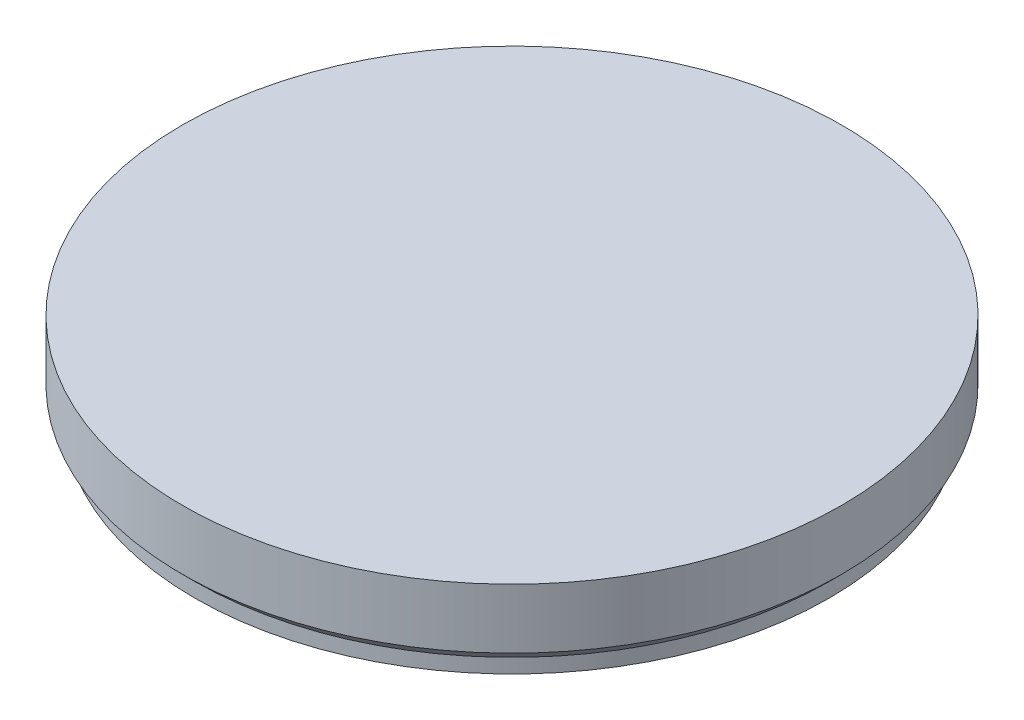
ISO-10303-21;
HEADER;
FILE_DESCRIPTION(('STEP AP214'),'2;1');
FILE_NAME('part.step','',(''),(''),'','','');
FILE_SCHEMA(('AUTOMOTIVE_DESIGN { 1 0 10303 214 1 1 1 1 }'));
ENDSEC;
DATA;
#1=APPLICATION_CONTEXT('core data for automotive mechanical design processes');
#2=APPLICATION_PROTOCOL_DEFINITION('international standard','automotive_design',2000,#1);
#3=PRODUCT_CONTEXT('',#1,'mechanical');
#4=PRODUCT('Part','Part','',(#3));
#5=PRODUCT_RELATED_PRODUCT_CATEGORY('part','',(#4));
#6=PRODUCT_DEFINITION_FORMATION('','',#4);
#7=PRODUCT_DEFINITION_CONTEXT('part definition',#1,'design');
#8=PRODUCT_DEFINITION('design','',#6,#7);
#9=PRODUCT_DEFINITION_SHAPE('','',#8);
#10=(LENGTH_UNIT() NAMED_UNIT(*) SI_UNIT(.MILLI.,.METRE.));
#11=(NAMED_UNIT(*) PLANE_ANGLE_UNIT() SI_UNIT($,.RADIAN.));
#12=(NAMED_UNIT(*) SI_UNIT($,.STERADIAN.) SOLID_ANGLE_UNIT());
#13=UNCERTAINTY_MEASURE_WITH_UNIT(LENGTH_MEASURE(1.E-05),#10,'distance_accuracy_value','');
#14=(GEOMETRIC_REPRESENTATION_CONTEXT(3) GLOBAL_UNCERTAINTY_ASSIGNED_CONTEXT((#13)) GLOBAL_UNIT_ASSIGNED_CONTEXT((#10,
#11,#12)) REPRESENTATION_CONTEXT('',''));
#15=CARTESIAN_POINT('',(0.,0.,0.));
#16=DIRECTION('',(0.,0.,1.));
#17=DIRECTION('',(1.,0.,0.));
#18=AXIS2_PLACEMENT_3D('',#15,#16,#17);
#19=CARTESIAN_POINT('',(0.,3.49999999999999,0.));
#20=DIRECTION('',(0.,1.,0.));
#21=DIRECTION('',(-1.,0.,0.));
#22=AXIS2_PLACEMENT_3D('',#19,#20,#21);
#23=CONICAL_SURFACE('',#22,77.,0.785398163397449);
#24=CARTESIAN_POINT('',(0.,3.49999999999999,0.));
#25=DIRECTION('',(0.,1.,0.));
#26=DIRECTION('',(-1.,0.,0.));
#27=AXIS2_PLACEMENT_3D('',#24,#25,#26);
#28=CIRCLE('',#27,77.);
#29=CARTESIAN_POINT('',(-77.,3.49999999999998,0.));
#30=VERTEX_POINT('',#29);
#31=EDGE_CURVE('E159',#30,#30,#28,.T.);
#32=ORIENTED_EDGE('',*,*,#31,.T.);
#33=EDGE_LOOP('',(#32));
#34=FACE_BOUND('',#33,.T.);
#35=CARTESIAN_POINT('',(0.,6.49999999999998,0.));
#36=DIRECTION('',(0.,1.,0.));
#37=DIRECTION('',(-1.,0.,0.));
#38=AXIS2_PLACEMENT_3D('',#35,#36,#37);
#39=CIRCLE('',#38,80.);
#40=CARTESIAN_POINT('',(-80.,6.49999999999997,0.));
#41=VERTEX_POINT('',#40);
#42=EDGE_CURVE('E116',#41,#41,#39,.F.);
#43=ORIENTED_EDGE('',*,*,#42,.T.);
#44=EDGE_LOOP('',(#43));
#45=FACE_BOUND('',#44,.T.);
#46=ADVANCED_FACE('F46',(#34,#45),#23,.T.);
#47=CARTESIAN_POINT('',(71.,12.,0.));
#48=DIRECTION('',(0.,1.,0.));
#49=DIRECTION('',(-1.,0.,0.));
#50=AXIS2_PLACEMENT_3D('',#47,#48,#49);
#51=PLANE('',#50);
#52=CARTESIAN_POINT('',(0.,12.,0.));
#53=DIRECTION('',(0.,-1.,0.));
#54=DIRECTION('',(1.,0.,0.));
#55=AXIS2_PLACEMENT_3D('',#52,#53,#54);
#56=CIRCLE('',#55,57.5);
#57=CARTESIAN_POINT('',(57.5,12.,0.));
#58=VERTEX_POINT('',#57);
#59=EDGE_CURVE('E148',#58,#58,#56,.T.);
#60=ORIENTED_EDGE('',*,*,#59,.F.);
#61=EDGE_LOOP('',(#60));
#62=FACE_BOUND('',#61,.T.);
#63=DIRECTION('',(0.,0.,1.));
#64=VECTOR('',#63,1.);
#65=CARTESIAN_POINT('',(60.875,12.,0.));
#66=LINE('',#65,#64);
#67=CARTESIAN_POINT('',(60.875,12.,-35.1461976369185));
#68=VERTEX_POINT('',#67);
#69=CARTESIAN_POINT('',(60.875,12.,35.1461976369185));
#70=VERTEX_POINT('',#69);
#71=EDGE_CURVE('E110',#68,#70,#66,.T.);
#72=ORIENTED_EDGE('',*,*,#71,.T.);
#73=DIRECTION('',(-0.866025403784439,0.,0.5));
#74=VECTOR('',#73,1.);
#75=CARTESIAN_POINT('',(30.4375,12.,52.7192964553777));
#76=LINE('',#75,#74);
#77=CARTESIAN_POINT('',(0.,12.,70.292395273837));
#78=VERTEX_POINT('',#77);
#79=EDGE_CURVE('E115',#70,#78,#76,.T.);
#80=ORIENTED_EDGE('',*,*,#79,.T.);
#81=DIRECTION('',(-0.866025403784439,0.,-0.5));
#82=VECTOR('',#81,1.);
#83=CARTESIAN_POINT('',(-30.4375,12.,52.7192964553777));
#84=LINE('',#83,#82);
#85=CARTESIAN_POINT('',(-60.875,12.,35.1461976369185));
#86=VERTEX_POINT('',#85);
#87=EDGE_CURVE('E130',#78,#86,#84,.T.);
#88=ORIENTED_EDGE('',*,*,#87,.T.);
#89=DIRECTION('',(0.,0.,-1.));
#90=VECTOR('',#89,1.);
#91=CARTESIAN_POINT('',(-60.875,12.,0.));
#92=LINE('',#91,#90);
#93=CARTESIAN_POINT('',(-60.875,12.,-35.1461976369185));
#94=VERTEX_POINT('',#93);
#95=EDGE_CURVE('E125',#86,#94,#92,.T.);
#96=ORIENTED_EDGE('',*,*,#95,.T.);
#97=DIRECTION('',(0.866025403784439,0.,-0.5));
#98=VECTOR('',#97,1.);
#99=CARTESIAN_POINT('',(-30.4375,12.,-52.7192964553777));
#100=LINE('',#99,#98);
#101=CARTESIAN_POINT('',(0.,12.,-70.2923952738369));
#102=VERTEX_POINT('',#101);
#103=EDGE_CURVE('E121',#94,#102,#100,.T.);
#104=ORIENTED_EDGE('',*,*,#103,.T.);
#105=DIRECTION('',(0.866025403784439,0.,0.5));
#106=VECTOR('',#105,1.);
#107=CARTESIAN_POINT('',(30.4375,12.,-52.7192964553777));
#108=LINE('',#107,#106);
#109=EDGE_CURVE('E103',#102,#68,#108,.T.);
#110=ORIENTED_EDGE('',*,*,#109,.T.);
#111=EDGE_LOOP('',(#72,#80,#88,#96,#104,#110));
#112=FACE_BOUND('',#111,.T.);
#113=ADVANCED_FACE('F118',(#62,#112),#51,.F.);
#114=CARTESIAN_POINT('',(30.4375,0.999999999999997,52.7192964553777));
#115=DIRECTION('',(-0.5,0.,-0.866025403784439));
#116=DIRECTION('',(-0.866025403784439,0.,0.5));
#117=AXIS2_PLACEMENT_3D('',#114,#115,#116);
#118=PLANE('',#117);
#119=ORIENTED_EDGE('',*,*,#79,.F.);
#120=DIRECTION('',(0.,1.,0.));
#121=VECTOR('',#120,1.);
#122=CARTESIAN_POINT('',(60.875,1.,35.1461976369185));
#123=LINE('',#122,#121);
#124=CARTESIAN_POINT('',(60.875,1.,35.1461976369185));
#125=VERTEX_POINT('',#124);
#126=EDGE_CURVE('E112',#125,#70,#123,.T.);
#127=ORIENTED_EDGE('',*,*,#126,.F.);
#128=DIRECTION('',(-0.866025403784439,0.,0.5));
#129=VECTOR('',#128,1.);
#130=CARTESIAN_POINT('',(30.4375,0.999999999999997,52.7192964553777));
#131=LINE('',#130,#129);
#132=CARTESIAN_POINT('',(0.,0.999999999999992,70.292395273837));
#133=VERTEX_POINT('',#132);
#134=EDGE_CURVE('E122',#125,#133,#131,.T.);
#135=ORIENTED_EDGE('',*,*,#134,.T.);
#136=DIRECTION('',(0.,1.,0.));
#137=VECTOR('',#136,1.);
#138=CARTESIAN_POINT('',(0.,0.999999999999992,70.292395273837));
#139=LINE('',#138,#137);
#140=EDGE_CURVE('E62',#133,#78,#139,.T.);
#141=ORIENTED_EDGE('',*,*,#140,.T.);
#142=EDGE_LOOP('',(#119,#127,#135,#141));
#143=FACE_BOUND('',#142,.T.);
#144=ADVANCED_FACE('F201',(#143),#118,.T.);
#145=CARTESIAN_POINT('',(60.875,1.,0.));
#146=DIRECTION('',(-1.,0.,0.));
#147=DIRECTION('',(0.,-1.,0.));
#148=AXIS2_PLACEMENT_3D('',#145,#146,#147);
#149=PLANE('',#148);
#150=ORIENTED_EDGE('',*,*,#71,.F.);
#151=DIRECTION('',(0.,1.,0.));
#152=VECTOR('',#151,1.);
#153=CARTESIAN_POINT('',(60.875,1.,-35.1461976369185));
#154=LINE('',#153,#152);
#155=CARTESIAN_POINT('',(60.875,1.,-35.1461976369185));
#156=VERTEX_POINT('',#155);
#157=EDGE_CURVE('E88',#156,#68,#154,.T.);
#158=ORIENTED_EDGE('',*,*,#157,.F.);
#159=DIRECTION('',(0.,0.,1.));
#160=VECTOR('',#159,1.);
#161=CARTESIAN_POINT('',(60.875,1.,0.));
#162=LINE('',#161,#160);
#163=EDGE_CURVE('E146',#156,#125,#162,.T.);
#164=ORIENTED_EDGE('',*,*,#163,.T.);
#165=ORIENTED_EDGE('',*,*,#126,.T.);
#166=EDGE_LOOP('',(#150,#158,#164,#165));
#167=FACE_BOUND('',#166,.T.);
#168=ADVANCED_FACE('F111',(#167),#149,.T.);
#169=CARTESIAN_POINT('',(30.4375,0.999999999999997,-52.7192964553777));
#170=DIRECTION('',(-0.5,0.,0.866025403784439));
#171=DIRECTION('',(0.866025403784439,0.,0.5));
#172=AXIS2_PLACEMENT_3D('',#169,#170,#171);
#173=PLANE('',#172);
#174=ORIENTED_EDGE('',*,*,#109,.F.);
#175=DIRECTION('',(0.,1.,0.));
#176=VECTOR('',#175,1.);
#177=CARTESIAN_POINT('',(0.,0.999999999999992,-70.2923952738369));
#178=LINE('',#177,#176);
#179=CARTESIAN_POINT('',(0.,0.999999999999992,-70.2923952738369));
#180=VERTEX_POINT('',#179);
#181=EDGE_CURVE('E142',#180,#102,#178,.T.);
#182=ORIENTED_EDGE('',*,*,#181,.F.);
#183=DIRECTION('',(0.866025403784439,0.,0.5));
#184=VECTOR('',#183,1.);
#185=CARTESIAN_POINT('',(30.4375,0.999999999999997,-52.7192964553777));
#186=LINE('',#185,#184);
#187=EDGE_CURVE('E106',#180,#156,#186,.T.);
#188=ORIENTED_EDGE('',*,*,#187,.T.);
#189=ORIENTED_EDGE('',*,*,#157,.T.);
#190=EDGE_LOOP('',(#174,#182,#188,#189));
#191=FACE_BOUND('',#190,.T.);
#192=ADVANCED_FACE('F101',(#191),#173,.T.);
#193=CARTESIAN_POINT('',(-30.4375,0.999999999999987,-52.7192964553777));
#194=DIRECTION('',(0.5,0.,0.866025403784439));
#195=DIRECTION('',(0.866025403784439,0.,-0.5));
#196=AXIS2_PLACEMENT_3D('',#193,#194,#195);
#197=PLANE('',#196);
#198=ORIENTED_EDGE('',*,*,#103,.F.);
#199=DIRECTION('',(0.,1.,0.));
#200=VECTOR('',#199,1.);
#201=CARTESIAN_POINT('',(-60.875,0.999999999999984,-35.1461976369185));
#202=LINE('',#201,#200);
#203=CARTESIAN_POINT('',(-60.875,0.999999999999984,-35.1461976369185));
#204=VERTEX_POINT('',#203);
#205=EDGE_CURVE('E138',#204,#94,#202,.T.);
#206=ORIENTED_EDGE('',*,*,#205,.F.);
#207=DIRECTION('',(0.866025403784439,0.,-0.5));
#208=VECTOR('',#207,1.);
#209=CARTESIAN_POINT('',(-30.4375,0.999999999999987,-52.7192964553777));
#210=LINE('',#209,#208);
#211=EDGE_CURVE('E107',#204,#180,#210,.T.);
#212=ORIENTED_EDGE('',*,*,#211,.T.);
#213=ORIENTED_EDGE('',*,*,#181,.T.);
#214=EDGE_LOOP('',(#198,#206,#212,#213));
#215=FACE_BOUND('',#214,.T.);
#216=ADVANCED_FACE('F188',(#215),#197,.T.);
#217=CARTESIAN_POINT('',(-60.875,0.999999999999984,0.));
#218=DIRECTION('',(1.,0.,0.));
#219=DIRECTION('',(0.,1.,0.));
#220=AXIS2_PLACEMENT_3D('',#217,#218,#219);
#221=PLANE('',#220);
#222=ORIENTED_EDGE('',*,*,#95,.F.);
#223=DIRECTION('',(0.,1.,0.));
#224=VECTOR('',#223,1.);
#225=CARTESIAN_POINT('',(-60.875,0.999999999999982,35.1461976369185));
#226=LINE('',#225,#224);
#227=CARTESIAN_POINT('',(-60.875,0.999999999999982,35.1461976369185));
#228=VERTEX_POINT('',#227);
#229=EDGE_CURVE('E135',#228,#86,#226,.T.);
#230=ORIENTED_EDGE('',*,*,#229,.F.);
#231=DIRECTION('',(0.,0.,-1.));
#232=VECTOR('',#231,1.);
#233=CARTESIAN_POINT('',(-60.875,0.999999999999984,0.));
#234=LINE('',#233,#232);
#235=EDGE_CURVE('E139',#228,#204,#234,.T.);
#236=ORIENTED_EDGE('',*,*,#235,.T.);
#237=ORIENTED_EDGE('',*,*,#205,.T.);
#238=EDGE_LOOP('',(#222,#230,#236,#237));
#239=FACE_BOUND('',#238,.T.);
#240=ADVANCED_FACE('F178',(#239),#221,.T.);
#241=CARTESIAN_POINT('',(-30.4375,0.999999999999987,52.7192964553777));
#242=DIRECTION('',(0.5,0.,-0.866025403784439));
#243=DIRECTION('',(-0.866025403784439,0.,-0.5));
#244=AXIS2_PLACEMENT_3D('',#241,#242,#243);
#245=PLANE('',#244);
#246=ORIENTED_EDGE('',*,*,#87,.F.);
#247=ORIENTED_EDGE('',*,*,#140,.F.);
#248=DIRECTION('',(-0.866025403784439,0.,-0.5));
#249=VECTOR('',#248,1.);
#250=CARTESIAN_POINT('',(-30.4375,0.999999999999987,52.7192964553777));
#251=LINE('',#250,#249);
#252=EDGE_CURVE('E136',#133,#228,#251,.T.);
#253=ORIENTED_EDGE('',*,*,#252,.T.);
#254=ORIENTED_EDGE('',*,*,#229,.T.);
#255=EDGE_LOOP('',(#246,#247,#253,#254));
#256=FACE_BOUND('',#255,.T.);
#257=ADVANCED_FACE('F180',(#256),#245,.T.);
#258=CARTESIAN_POINT('',(0.,0.999999999999992,0.));
#259=DIRECTION('',(0.,-1.,0.));
#260=DIRECTION('',(1.,0.,0.));
#261=AXIS2_PLACEMENT_3D('',#258,#259,#260);
#262=PLANE('',#261);
#263=ORIENTED_EDGE('',*,*,#134,.F.);
#264=ORIENTED_EDGE('',*,*,#163,.F.);
#265=ORIENTED_EDGE('',*,*,#187,.F.);
#266=ORIENTED_EDGE('',*,*,#211,.F.);
#267=ORIENTED_EDGE('',*,*,#235,.F.);
#268=ORIENTED_EDGE('',*,*,#252,.F.);
#269=EDGE_LOOP('',(#263,#264,#265,#266,#267,#268));
#270=FACE_BOUND('',#269,.T.);
#271=CARTESIAN_POINT('',(0.,0.999999999999992,0.));
#272=DIRECTION('',(0.,-1.,0.));
#273=DIRECTION('',(1.,0.,0.));
#274=AXIS2_PLACEMENT_3D('',#271,#272,#273);
#275=CIRCLE('',#274,71.);
#276=CARTESIAN_POINT('',(71.,1.,0.));
#277=VERTEX_POINT('',#276);
#278=EDGE_CURVE('E131',#277,#277,#275,.T.);
#279=ORIENTED_EDGE('',*,*,#278,.T.);
#280=EDGE_LOOP('',(#279));
#281=FACE_BOUND('',#280,.T.);
#282=ADVANCED_FACE('F184',(#270,#281),#262,.T.);
#283=CARTESIAN_POINT('',(0.,12.,0.));
#284=DIRECTION('',(0.,1.,0.));
#285=DIRECTION('',(-1.,0.,0.));
#286=AXIS2_PLACEMENT_3D('',#283,#284,#285);
#287=CYLINDRICAL_SURFACE('',#286,77.);
#288=ORIENTED_EDGE('',*,*,#31,.F.);
#289=EDGE_LOOP('',(#288));
#290=FACE_BOUND('',#289,.T.);
#291=CARTESIAN_POINT('',(0.,0.,0.));
#292=DIRECTION('',(0.,1.,0.));
#293=DIRECTION('',(-1.,0.,0.));
#294=AXIS2_PLACEMENT_3D('',#291,#292,#293);
#295=CIRCLE('',#294,77.);
#296=CARTESIAN_POINT('',(-77.,0.,0.));
#297=VERTEX_POINT('',#296);
#298=EDGE_CURVE('E134',#297,#297,#295,.T.);
#299=ORIENTED_EDGE('',*,*,#298,.T.);
#300=EDGE_LOOP('',(#299));
#301=FACE_BOUND('',#300,.T.);
#302=ADVANCED_FACE('F221',(#290,#301),#287,.T.);
#303=CARTESIAN_POINT('',(77.,0.,0.));
#304=DIRECTION('',(0.,1.,0.));
#305=DIRECTION('',(-1.,0.,0.));
#306=AXIS2_PLACEMENT_3D('',#303,#304,#305);
#307=PLANE('',#306);
#308=ORIENTED_EDGE('',*,*,#298,.F.);
#309=EDGE_LOOP('',(#308));
#310=FACE_BOUND('',#309,.T.);
#311=CARTESIAN_POINT('',(0.,0.,0.));
#312=DIRECTION('',(0.,1.,0.));
#313=DIRECTION('',(-1.,0.,0.));
#314=AXIS2_PLACEMENT_3D('',#311,#312,#313);
#315=CIRCLE('',#314,71.);
#316=CARTESIAN_POINT('',(-71.,0.,0.));
#317=VERTEX_POINT('',#316);
#318=EDGE_CURVE('E152',#317,#317,#315,.T.);
#319=ORIENTED_EDGE('',*,*,#318,.T.);
#320=EDGE_LOOP('',(#319));
#321=FACE_BOUND('',#320,.T.);
#322=ADVANCED_FACE('F217',(#310,#321),#307,.F.);
#323=CARTESIAN_POINT('',(0.,12.,0.));
#324=DIRECTION('',(0.,1.,0.));
#325=DIRECTION('',(-1.,0.,0.));
#326=AXIS2_PLACEMENT_3D('',#323,#324,#325);
#327=CYLINDRICAL_SURFACE('',#326,71.);
#328=ORIENTED_EDGE('',*,*,#278,.F.);
#329=EDGE_LOOP('',(#328));
#330=FACE_BOUND('',#329,.T.);
#331=ORIENTED_EDGE('',*,*,#318,.F.);
#332=EDGE_LOOP('',(#331));
#333=FACE_BOUND('',#332,.T.);
#334=ADVANCED_FACE('F213',(#330,#333),#327,.F.);
#335=CARTESIAN_POINT('',(0.,13.,0.));
#336=DIRECTION('',(0.,-1.,0.));
#337=DIRECTION('',(1.,0.,0.));
#338=AXIS2_PLACEMENT_3D('',#335,#336,#337);
#339=CYLINDRICAL_SURFACE('',#338,57.5);
#340=ORIENTED_EDGE('',*,*,#59,.T.);
#341=EDGE_LOOP('',(#340));
#342=FACE_BOUND('',#341,.T.);
#343=CARTESIAN_POINT('',(0.,15.,0.));
#344=DIRECTION('',(0.,-1.,0.));
#345=DIRECTION('',(1.,0.,0.));
#346=AXIS2_PLACEMENT_3D('',#343,#344,#345);
#347=CIRCLE('',#346,57.5);
#348=CARTESIAN_POINT('',(57.5,15.,0.));
#349=VERTEX_POINT('',#348);
#350=EDGE_CURVE('E151',#349,#349,#347,.T.);
#351=ORIENTED_EDGE('',*,*,#350,.F.);
#352=EDGE_LOOP('',(#351));
#353=FACE_BOUND('',#352,.T.);
#354=ADVANCED_FACE('F216',(#342,#353),#339,.F.);
#355=CARTESIAN_POINT('',(0.,15.,0.));
#356=DIRECTION('',(0.,-1.,0.));
#357=DIRECTION('',(1.,0.,0.));
#358=AXIS2_PLACEMENT_3D('',#355,#356,#357);
#359=PLANE('',#358);
#360=CARTESIAN_POINT('',(0.,15.,0.));
#361=DIRECTION('',(0.,-1.,0.));
#362=DIRECTION('',(1.,0.,0.));
#363=AXIS2_PLACEMENT_3D('',#360,#361,#362);
#364=CIRCLE('',#363,23.75);
#365=CARTESIAN_POINT('',(23.75,15.,0.));
#366=VERTEX_POINT('',#365);
#367=EDGE_CURVE('E54',#366,#366,#364,.T.);
#368=ORIENTED_EDGE('',*,*,#367,.F.);
#369=EDGE_LOOP('',(#368));
#370=FACE_BOUND('',#369,.T.);
#371=ORIENTED_EDGE('',*,*,#350,.T.);
#372=EDGE_LOOP('',(#371));
#373=FACE_BOUND('',#372,.T.);
#374=ADVANCED_FACE('F297',(#370,#373),#359,.T.);
#375=CARTESIAN_POINT('',(0.,8.99999999999999,0.));
#376=DIRECTION('',(0.,1.,0.));
#377=DIRECTION('',(-1.,0.,0.));
#378=AXIS2_PLACEMENT_3D('',#375,#376,#377);
#379=PLANE('',#378);
#380=CARTESIAN_POINT('',(0.,8.99999999999999,0.));
#381=DIRECTION('',(0.,1.,0.));
#382=DIRECTION('',(-1.,0.,0.));
#383=AXIS2_PLACEMENT_3D('',#380,#381,#382);
#384=CIRCLE('',#383,6.5);
#385=CARTESIAN_POINT('',(-6.5,8.99999999999999,0.));
#386=VERTEX_POINT('',#385);
#387=EDGE_CURVE('E155',#386,#386,#384,.T.);
#388=ORIENTED_EDGE('',*,*,#387,.F.);
#389=EDGE_LOOP('',(#388));
#390=FACE_BOUND('',#389,.T.);
#391=ADVANCED_FACE('F308',(#390),#379,.F.);
#392=CARTESIAN_POINT('',(0.,12.,0.));
#393=DIRECTION('',(0.,1.,0.));
#394=DIRECTION('',(-1.,0.,0.));
#395=AXIS2_PLACEMENT_3D('',#392,#393,#394);
#396=CYLINDRICAL_SURFACE('',#395,6.5);
#397=CARTESIAN_POINT('',(0.,5.99999999999999,0.));
#398=DIRECTION('',(0.,1.,0.));
#399=DIRECTION('',(-1.,0.,0.));
#400=AXIS2_PLACEMENT_3D('',#397,#398,#399);
#401=CIRCLE('',#400,6.5);
#402=CARTESIAN_POINT('',(-6.5,5.99999999999999,0.));
#403=VERTEX_POINT('',#402);
#404=EDGE_CURVE('E487',#403,#403,#401,.T.);
#405=ORIENTED_EDGE('',*,*,#404,.F.);
#406=EDGE_LOOP('',(#405));
#407=FACE_BOUND('',#406,.T.);
#408=ORIENTED_EDGE('',*,*,#387,.T.);
#409=EDGE_LOOP('',(#408));
#410=FACE_BOUND('',#409,.T.);
#411=ADVANCED_FACE('F319',(#407,#410),#396,.F.);
#412=CARTESIAN_POINT('',(6.5,5.99999999999999,0.));
#413=DIRECTION('',(0.,1.,0.));
#414=DIRECTION('',(-1.,0.,0.));
#415=AXIS2_PLACEMENT_3D('',#412,#413,#414);
#416=PLANE('',#415);
#417=CARTESIAN_POINT('',(0.,5.99999999999999,0.));
#418=DIRECTION('',(0.,1.,0.));
#419=DIRECTION('',(-1.,0.,0.));
#420=AXIS2_PLACEMENT_3D('',#417,#418,#419);
#421=CIRCLE('',#420,21.25);
#422=CARTESIAN_POINT('',(-21.25,5.99999999999999,0.));
#423=VERTEX_POINT('',#422);
#424=EDGE_CURVE('E475',#423,#423,#421,.T.);
#425=ORIENTED_EDGE('',*,*,#424,.F.);
#426=EDGE_LOOP('',(#425));
#427=FACE_BOUND('',#426,.T.);
#428=ORIENTED_EDGE('',*,*,#404,.T.);
#429=EDGE_LOOP('',(#428));
#430=FACE_BOUND('',#429,.T.);
#431=ADVANCED_FACE('F330',(#427,#430),#416,.F.);
#432=CARTESIAN_POINT('',(0.,12.,0.));
#433=DIRECTION('',(0.,1.,0.));
#434=DIRECTION('',(-1.,0.,0.));
#435=AXIS2_PLACEMENT_3D('',#432,#433,#434);
#436=CYLINDRICAL_SURFACE('',#435,21.25);
#437=CARTESIAN_POINT('',(0.,-7.50000000000001,0.));
#438=DIRECTION('',(0.,1.,0.));
#439=DIRECTION('',(-1.,0.,0.));
#440=AXIS2_PLACEMENT_3D('',#437,#438,#439);
#441=CIRCLE('',#440,21.25);
#442=CARTESIAN_POINT('',(-21.25,-7.50000000000001,0.));
#443=VERTEX_POINT('',#442);
#444=EDGE_CURVE('E472',#443,#443,#441,.T.);
#445=ORIENTED_EDGE('',*,*,#444,.F.);
#446=EDGE_LOOP('',(#445));
#447=FACE_BOUND('',#446,.T.);
#448=ORIENTED_EDGE('',*,*,#424,.T.);
#449=EDGE_LOOP('',(#448));
#450=FACE_BOUND('',#449,.T.);
#451=ADVANCED_FACE('F341',(#447,#450),#436,.F.);
#452=CARTESIAN_POINT('',(21.25,-7.50000000000001,0.));
#453=DIRECTION('',(0.,1.,0.));
#454=DIRECTION('',(-1.,0.,0.));
#455=AXIS2_PLACEMENT_3D('',#452,#453,#454);
#456=PLANE('',#455);
#457=CARTESIAN_POINT('',(0.,-7.50000000000001,0.));
#458=DIRECTION('',(0.,1.,0.));
#459=DIRECTION('',(-1.,0.,0.));
#460=AXIS2_PLACEMENT_3D('',#457,#458,#459);
#461=CIRCLE('',#460,23.75);
#462=CARTESIAN_POINT('',(-23.75,-7.50000000000001,0.));
#463=VERTEX_POINT('',#462);
#464=EDGE_CURVE('E157',#463,#463,#461,.T.);
#465=ORIENTED_EDGE('',*,*,#464,.F.);
#466=EDGE_LOOP('',(#465));
#467=FACE_BOUND('',#466,.T.);
#468=ORIENTED_EDGE('',*,*,#444,.T.);
#469=EDGE_LOOP('',(#468));
#470=FACE_BOUND('',#469,.T.);
#471=ADVANCED_FACE('F352',(#467,#470),#456,.F.);
#472=CARTESIAN_POINT('',(0.,12.,0.));
#473=DIRECTION('',(0.,1.,0.));
#474=DIRECTION('',(-1.,0.,0.));
#475=AXIS2_PLACEMENT_3D('',#472,#473,#474);
#476=CYLINDRICAL_SURFACE('',#475,23.75);
#477=ORIENTED_EDGE('',*,*,#464,.T.);
#478=EDGE_LOOP('',(#477));
#479=FACE_BOUND('',#478,.T.);
#480=ORIENTED_EDGE('',*,*,#367,.T.);
#481=EDGE_LOOP('',(#480));
#482=FACE_BOUND('',#481,.T.);
#483=ADVANCED_FACE('F211',(#479,#482),#476,.T.);
#484=CARTESIAN_POINT('',(0.,-7.50100000000003,0.));
#485=DIRECTION('',(0.,1.,0.));
#486=DIRECTION('',(-1.,0.,0.));
#487=AXIS2_PLACEMENT_3D('',#484,#485,#486);
#488=CYLINDRICAL_SURFACE('',#487,80.);
#489=CARTESIAN_POINT('',(0.,21.,0.));
#490=DIRECTION('',(0.,1.,0.));
#491=DIRECTION('',(-1.,0.,0.));
#492=AXIS2_PLACEMENT_3D('',#489,#490,#491);
#493=CIRCLE('',#492,80.);
#494=CARTESIAN_POINT('',(-80.,21.,0.));
#495=VERTEX_POINT('',#494);
#496=EDGE_CURVE('E11',#495,#495,#493,.T.);
#497=ORIENTED_EDGE('',*,*,#496,.F.);
#498=EDGE_LOOP('',(#497));
#499=FACE_BOUND('',#498,.T.);
#500=ORIENTED_EDGE('',*,*,#42,.F.);
#501=EDGE_LOOP('',(#500));
#502=FACE_BOUND('',#501,.T.);
#503=ADVANCED_FACE('F372',(#499,#502),#488,.T.);
#504=CARTESIAN_POINT('',(0.,21.,0.));
#505=DIRECTION('',(0.,1.,0.));
#506=DIRECTION('',(-1.,0.,0.));
#507=AXIS2_PLACEMENT_3D('',#504,#505,#506);
#508=PLANE('',#507);
#509=ORIENTED_EDGE('',*,*,#496,.T.);
#510=EDGE_LOOP('',(#509));
#511=FACE_BOUND('',#510,.T.);
#512=ADVANCED_FACE('F381',(#511),#508,.T.);
#513=CLOSED_SHELL('',(#46,#113,#144,#168,#192,#216,#240,#257,#282,#302,#322,#334,#354,#374,#391,
#411,#431,#451,#471,#483,#503,#512));
#514=MANIFOLD_SOLID_BREP('B2',#513);
#515=ADVANCED_BREP_SHAPE_REPRESENTATION('',(#18,#514),#14);
#516=SHAPE_DEFINITION_REPRESENTATION(#9,#515);
ENDSEC;
END-ISO-10303-21;
